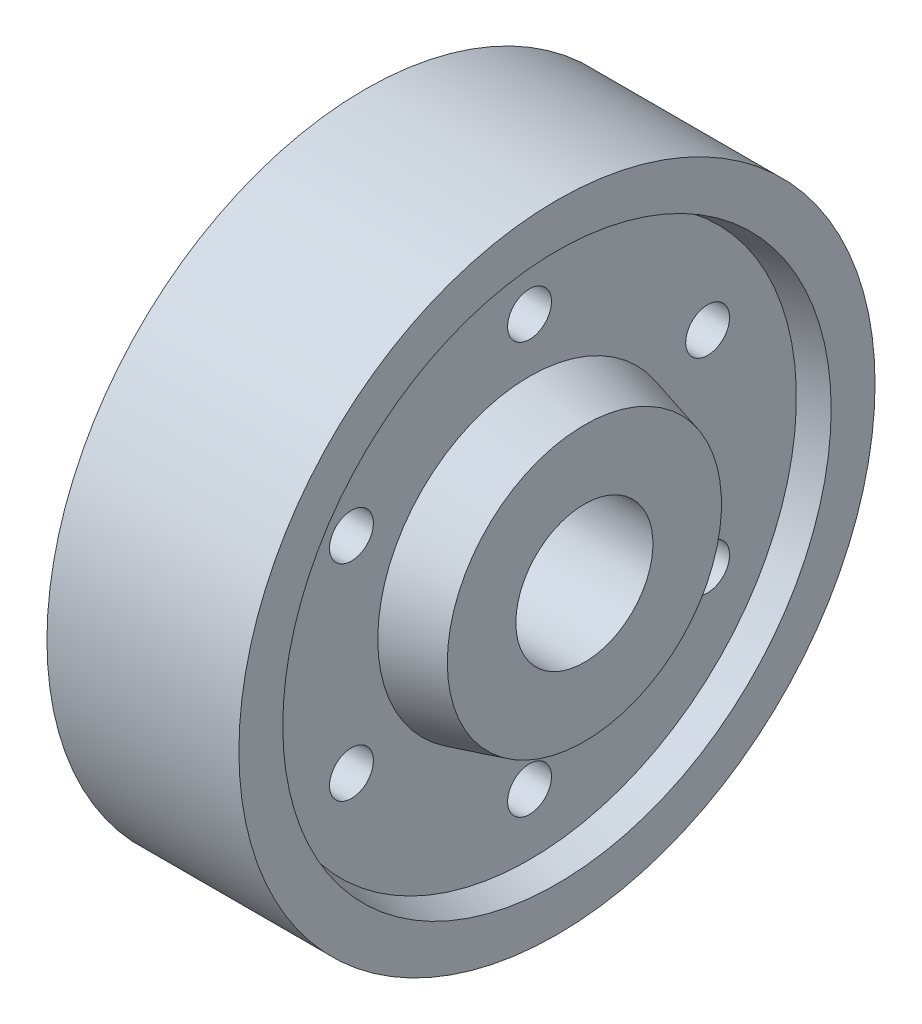
ISO-10303-21;
HEADER;
FILE_DESCRIPTION(('STEP AP214'),'2;1');
FILE_NAME('part.step','',(''),(''),'','','');
FILE_SCHEMA(('AUTOMOTIVE_DESIGN { 1 0 10303 214 1 1 1 1 }'));
ENDSEC;
DATA;
#1=APPLICATION_CONTEXT('core data for automotive mechanical design processes');
#2=APPLICATION_PROTOCOL_DEFINITION('international standard','automotive_design',2000,#1);
#3=PRODUCT_CONTEXT('',#1,'mechanical');
#4=PRODUCT('Part','Part','',(#3));
#5=PRODUCT_RELATED_PRODUCT_CATEGORY('part','',(#4));
#6=PRODUCT_DEFINITION_FORMATION('','',#4);
#7=PRODUCT_DEFINITION_CONTEXT('part definition',#1,'design');
#8=PRODUCT_DEFINITION('design','',#6,#7);
#9=PRODUCT_DEFINITION_SHAPE('','',#8);
#10=(LENGTH_UNIT() NAMED_UNIT(*) SI_UNIT(.MILLI.,.METRE.));
#11=(NAMED_UNIT(*) PLANE_ANGLE_UNIT() SI_UNIT($,.RADIAN.));
#12=(NAMED_UNIT(*) SI_UNIT($,.STERADIAN.) SOLID_ANGLE_UNIT());
#13=UNCERTAINTY_MEASURE_WITH_UNIT(LENGTH_MEASURE(1.E-05),#10,'distance_accuracy_value','');
#14=(GEOMETRIC_REPRESENTATION_CONTEXT(3) GLOBAL_UNCERTAINTY_ASSIGNED_CONTEXT((#13)) GLOBAL_UNIT_ASSIGNED_CONTEXT((#10,
#11,#12)) REPRESENTATION_CONTEXT('',''));
#15=CARTESIAN_POINT('',(0.,0.,0.));
#16=DIRECTION('',(0.,0.,1.));
#17=DIRECTION('',(1.,0.,0.));
#18=AXIS2_PLACEMENT_3D('',#15,#16,#17);
#19=CARTESIAN_POINT('',(0.,0.,0.));
#20=DIRECTION('',(-1.,0.,0.));
#21=DIRECTION('',(0.,0.,1.));
#22=AXIS2_PLACEMENT_3D('',#19,#20,#21);
#23=CYLINDRICAL_SURFACE('',#22,12.5);
#24=CARTESIAN_POINT('',(45.,0.,0.));
#25=DIRECTION('',(-1.,0.,0.));
#26=DIRECTION('',(0.,0.,1.));
#27=AXIS2_PLACEMENT_3D('',#24,#25,#26);
#28=CIRCLE('',#27,12.5);
#29=CARTESIAN_POINT('',(45.,0.,12.5));
#30=VERTEX_POINT('',#29);
#31=EDGE_CURVE('E10',#30,#30,#28,.T.);
#32=ORIENTED_EDGE('',*,*,#31,.F.);
#33=EDGE_LOOP('',(#32));
#34=FACE_BOUND('',#33,.T.);
#35=CARTESIAN_POINT('',(0.,0.,0.));
#36=DIRECTION('',(-1.,0.,0.));
#37=DIRECTION('',(0.,0.,1.));
#38=AXIS2_PLACEMENT_3D('',#35,#36,#37);
#39=CIRCLE('',#38,12.5);
#40=CARTESIAN_POINT('',(0.,0.,12.5));
#41=VERTEX_POINT('',#40);
#42=EDGE_CURVE('E68',#41,#41,#39,.T.);
#43=ORIENTED_EDGE('',*,*,#42,.T.);
#44=EDGE_LOOP('',(#43));
#45=FACE_BOUND('',#44,.T.);
#46=ADVANCED_FACE('F40',(#34,#45),#23,.F.);
#47=CARTESIAN_POINT('',(45.,0.,0.));
#48=DIRECTION('',(-1.,0.,0.));
#49=DIRECTION('',(0.,0.,1.));
#50=AXIS2_PLACEMENT_3D('',#47,#48,#49);
#51=PLANE('',#50);
#52=CARTESIAN_POINT('',(45.,0.,0.));
#53=DIRECTION('',(-1.,0.,0.));
#54=DIRECTION('',(0.,0.,1.));
#55=AXIS2_PLACEMENT_3D('',#52,#53,#54);
#56=CIRCLE('',#55,25.);
#57=CARTESIAN_POINT('',(45.,0.,25.));
#58=VERTEX_POINT('',#57);
#59=EDGE_CURVE('E42',#58,#58,#56,.T.);
#60=ORIENTED_EDGE('',*,*,#59,.F.);
#61=EDGE_LOOP('',(#60));
#62=FACE_BOUND('',#61,.T.);
#63=ORIENTED_EDGE('',*,*,#31,.T.);
#64=EDGE_LOOP('',(#63));
#65=FACE_BOUND('',#64,.T.);
#66=ADVANCED_FACE('F115',(#62,#65),#51,.F.);
#67=CARTESIAN_POINT('',(45.,0.,0.));
#68=DIRECTION('',(-1.,0.,0.));
#69=DIRECTION('',(0.,0.,1.));
#70=AXIS2_PLACEMENT_3D('',#67,#68,#69);
#71=CONICAL_SURFACE('',#70,25.,0.261799387799147);
#72=CARTESIAN_POINT('',(35.,0.,0.));
#73=DIRECTION('',(-1.,0.,0.));
#74=DIRECTION('',(0.,0.,1.));
#75=AXIS2_PLACEMENT_3D('',#72,#73,#74);
#76=CIRCLE('',#75,27.6794919243112);
#77=CARTESIAN_POINT('',(35.,0.,27.6794919243112));
#78=VERTEX_POINT('',#77);
#79=EDGE_CURVE('E47',#78,#78,#76,.T.);
#80=ORIENTED_EDGE('',*,*,#79,.F.);
#81=EDGE_LOOP('',(#80));
#82=FACE_BOUND('',#81,.T.);
#83=ORIENTED_EDGE('',*,*,#59,.T.);
#84=EDGE_LOOP('',(#83));
#85=FACE_BOUND('',#84,.T.);
#86=ADVANCED_FACE('F108',(#82,#85),#71,.T.);
#87=CARTESIAN_POINT('',(35.,0.,0.));
#88=DIRECTION('',(-1.,0.,0.));
#89=DIRECTION('',(0.,0.,1.));
#90=AXIS2_PLACEMENT_3D('',#87,#88,#89);
#91=PLANE('',#90);
#92=CARTESIAN_POINT('',(35.,37.5,0.));
#93=DIRECTION('',(-1.,0.,0.));
#94=DIRECTION('',(0.,0.,1.));
#95=AXIS2_PLACEMENT_3D('',#92,#93,#94);
#96=CIRCLE('',#95,4.);
#97=CARTESIAN_POINT('',(35.,37.5,4.));
#98=VERTEX_POINT('',#97);
#99=EDGE_CURVE('E37',#98,#98,#96,.T.);
#100=ORIENTED_EDGE('',*,*,#99,.T.);
#101=EDGE_LOOP('',(#100));
#102=FACE_BOUND('',#101,.T.);
#103=CARTESIAN_POINT('',(35.,18.7500000000004,32.4759526419162));
#104=DIRECTION('',(-1.,0.,0.));
#105=DIRECTION('',(0.,0.,1.));
#106=AXIS2_PLACEMENT_3D('',#103,#104,#105);
#107=CIRCLE('',#106,4.00000000000001);
#108=CARTESIAN_POINT('',(35.,18.7500000000004,36.4759526419162));
#109=VERTEX_POINT('',#108);
#110=EDGE_CURVE('E62',#109,#109,#107,.T.);
#111=ORIENTED_EDGE('',*,*,#110,.T.);
#112=EDGE_LOOP('',(#111));
#113=FACE_BOUND('',#112,.T.);
#114=CARTESIAN_POINT('',(35.,-18.7499999999997,32.4759526419166));
#115=DIRECTION('',(-1.,0.,0.));
#116=DIRECTION('',(0.,0.,1.));
#117=AXIS2_PLACEMENT_3D('',#114,#115,#116);
#118=CIRCLE('',#117,4.);
#119=CARTESIAN_POINT('',(35.,-18.7499999999997,36.4759526419166));
#120=VERTEX_POINT('',#119);
#121=EDGE_CURVE('E65',#120,#120,#118,.T.);
#122=ORIENTED_EDGE('',*,*,#121,.T.);
#123=EDGE_LOOP('',(#122));
#124=FACE_BOUND('',#123,.T.);
#125=CARTESIAN_POINT('',(35.,-37.5,2.61861100413235E-13));
#126=DIRECTION('',(-1.,0.,0.));
#127=DIRECTION('',(0.,0.,1.));
#128=AXIS2_PLACEMENT_3D('',#125,#126,#127);
#129=CIRCLE('',#128,4.);
#130=CARTESIAN_POINT('',(35.,-37.5,4.00000000000026));
#131=VERTEX_POINT('',#130);
#132=EDGE_CURVE('E58',#131,#131,#129,.T.);
#133=ORIENTED_EDGE('',*,*,#132,.T.);
#134=EDGE_LOOP('',(#133));
#135=FACE_BOUND('',#134,.T.);
#136=CARTESIAN_POINT('',(35.,-18.7500000000002,-32.4759526419164));
#137=DIRECTION('',(-1.,0.,0.));
#138=DIRECTION('',(0.,0.,1.));
#139=AXIS2_PLACEMENT_3D('',#136,#137,#138);
#140=CIRCLE('',#139,4.);
#141=CARTESIAN_POINT('',(35.,-18.7500000000002,-28.4759526419164));
#142=VERTEX_POINT('',#141);
#143=EDGE_CURVE('E57',#142,#142,#140,.T.);
#144=ORIENTED_EDGE('',*,*,#143,.T.);
#145=EDGE_LOOP('',(#144));
#146=FACE_BOUND('',#145,.T.);
#147=CARTESIAN_POINT('',(35.,18.7499999999999,-32.4759526419165));
#148=DIRECTION('',(-1.,0.,0.));
#149=DIRECTION('',(0.,0.,1.));
#150=AXIS2_PLACEMENT_3D('',#147,#148,#149);
#151=CIRCLE('',#150,4.);
#152=CARTESIAN_POINT('',(35.,18.7499999999999,-28.4759526419165));
#153=VERTEX_POINT('',#152);
#154=EDGE_CURVE('E52',#153,#153,#151,.T.);
#155=ORIENTED_EDGE('',*,*,#154,.T.);
#156=EDGE_LOOP('',(#155));
#157=FACE_BOUND('',#156,.T.);
#158=CARTESIAN_POINT('',(35.,0.,0.));
#159=DIRECTION('',(-1.,0.,0.));
#160=DIRECTION('',(0.,0.,1.));
#161=AXIS2_PLACEMENT_3D('',#158,#159,#160);
#162=CIRCLE('',#161,48.6602540378444);
#163=CARTESIAN_POINT('',(35.,0.,48.6602540378444));
#164=VERTEX_POINT('',#163);
#165=EDGE_CURVE('E105',#164,#164,#162,.T.);
#166=ORIENTED_EDGE('',*,*,#165,.F.);
#167=EDGE_LOOP('',(#166));
#168=FACE_BOUND('',#167,.T.);
#169=ORIENTED_EDGE('',*,*,#79,.T.);
#170=EDGE_LOOP('',(#169));
#171=FACE_BOUND('',#170,.T.);
#172=ADVANCED_FACE('F110',(#102,#113,#124,#135,#146,#157,#168,#171),#91,.F.);
#173=CARTESIAN_POINT('',(35.,0.,0.));
#174=DIRECTION('',(1.,0.,0.));
#175=DIRECTION('',(0.,0.,-1.));
#176=AXIS2_PLACEMENT_3D('',#173,#174,#175);
#177=CONICAL_SURFACE('',#176,48.6602540378444,0.261799387799145);
#178=CARTESIAN_POINT('',(40.,0.,0.));
#179=DIRECTION('',(-1.,0.,0.));
#180=DIRECTION('',(0.,0.,1.));
#181=AXIS2_PLACEMENT_3D('',#178,#179,#180);
#182=CIRCLE('',#181,50.);
#183=CARTESIAN_POINT('',(40.,0.,50.));
#184=VERTEX_POINT('',#183);
#185=EDGE_CURVE('E97',#184,#184,#182,.T.);
#186=ORIENTED_EDGE('',*,*,#185,.F.);
#187=EDGE_LOOP('',(#186));
#188=FACE_BOUND('',#187,.T.);
#189=ORIENTED_EDGE('',*,*,#165,.T.);
#190=EDGE_LOOP('',(#189));
#191=FACE_BOUND('',#190,.T.);
#192=ADVANCED_FACE('F121',(#188,#191),#177,.F.);
#193=CARTESIAN_POINT('',(40.,0.,0.));
#194=DIRECTION('',(-1.,0.,0.));
#195=DIRECTION('',(0.,0.,1.));
#196=AXIS2_PLACEMENT_3D('',#193,#194,#195);
#197=PLANE('',#196);
#198=CARTESIAN_POINT('',(40.,0.,0.));
#199=DIRECTION('',(-1.,0.,0.));
#200=DIRECTION('',(0.,0.,1.));
#201=AXIS2_PLACEMENT_3D('',#198,#199,#200);
#202=CIRCLE('',#201,58.);
#203=CARTESIAN_POINT('',(40.,0.,58.));
#204=VERTEX_POINT('',#203);
#205=EDGE_CURVE('E96',#204,#204,#202,.T.);
#206=ORIENTED_EDGE('',*,*,#205,.F.);
#207=EDGE_LOOP('',(#206));
#208=FACE_BOUND('',#207,.T.);
#209=ORIENTED_EDGE('',*,*,#185,.T.);
#210=EDGE_LOOP('',(#209));
#211=FACE_BOUND('',#210,.T.);
#212=ADVANCED_FACE('F130',(#208,#211),#197,.F.);
#213=CARTESIAN_POINT('',(0.,0.,0.));
#214=DIRECTION('',(-1.,0.,0.));
#215=DIRECTION('',(0.,0.,1.));
#216=AXIS2_PLACEMENT_3D('',#213,#214,#215);
#217=CYLINDRICAL_SURFACE('',#216,58.);
#218=ORIENTED_EDGE('',*,*,#205,.T.);
#219=EDGE_LOOP('',(#218));
#220=FACE_BOUND('',#219,.T.);
#221=CARTESIAN_POINT('',(5.,0.,0.));
#222=DIRECTION('',(-1.,0.,0.));
#223=DIRECTION('',(0.,0.,1.));
#224=AXIS2_PLACEMENT_3D('',#221,#222,#223);
#225=CIRCLE('',#224,58.);
#226=CARTESIAN_POINT('',(5.,0.,58.));
#227=VERTEX_POINT('',#226);
#228=EDGE_CURVE('E91',#227,#227,#225,.T.);
#229=ORIENTED_EDGE('',*,*,#228,.F.);
#230=EDGE_LOOP('',(#229));
#231=FACE_BOUND('',#230,.T.);
#232=ADVANCED_FACE('F134',(#220,#231),#217,.T.);
#233=CARTESIAN_POINT('',(5.,0.,0.));
#234=DIRECTION('',(-1.,0.,0.));
#235=DIRECTION('',(0.,0.,1.));
#236=AXIS2_PLACEMENT_3D('',#233,#234,#235);
#237=PLANE('',#236);
#238=ORIENTED_EDGE('',*,*,#228,.T.);
#239=EDGE_LOOP('',(#238));
#240=FACE_BOUND('',#239,.T.);
#241=CARTESIAN_POINT('',(5.,0.,0.));
#242=DIRECTION('',(-1.,0.,0.));
#243=DIRECTION('',(0.,0.,1.));
#244=AXIS2_PLACEMENT_3D('',#241,#242,#243);
#245=CIRCLE('',#244,50.);
#246=CARTESIAN_POINT('',(5.,0.,50.));
#247=VERTEX_POINT('',#246);
#248=EDGE_CURVE('E89',#247,#247,#245,.T.);
#249=ORIENTED_EDGE('',*,*,#248,.F.);
#250=EDGE_LOOP('',(#249));
#251=FACE_BOUND('',#250,.T.);
#252=ADVANCED_FACE('F132',(#240,#251),#237,.T.);
#253=CARTESIAN_POINT('',(10.,0.,0.));
#254=DIRECTION('',(-1.,0.,0.));
#255=DIRECTION('',(0.,0.,1.));
#256=AXIS2_PLACEMENT_3D('',#253,#254,#255);
#257=CONICAL_SURFACE('',#256,48.6602540378444,0.261799387799145);
#258=ORIENTED_EDGE('',*,*,#248,.T.);
#259=EDGE_LOOP('',(#258));
#260=FACE_BOUND('',#259,.T.);
#261=CARTESIAN_POINT('',(10.,0.,0.));
#262=DIRECTION('',(-1.,0.,0.));
#263=DIRECTION('',(0.,0.,1.));
#264=AXIS2_PLACEMENT_3D('',#261,#262,#263);
#265=CIRCLE('',#264,48.6602540378444);
#266=CARTESIAN_POINT('',(10.,0.,48.6602540378444));
#267=VERTEX_POINT('',#266);
#268=EDGE_CURVE('E87',#267,#267,#265,.T.);
#269=ORIENTED_EDGE('',*,*,#268,.F.);
#270=EDGE_LOOP('',(#269));
#271=FACE_BOUND('',#270,.T.);
#272=ADVANCED_FACE('F136',(#260,#271),#257,.F.);
#273=CARTESIAN_POINT('',(10.,0.,0.));
#274=DIRECTION('',(-1.,0.,0.));
#275=DIRECTION('',(0.,0.,1.));
#276=AXIS2_PLACEMENT_3D('',#273,#274,#275);
#277=PLANE('',#276);
#278=CARTESIAN_POINT('',(10.,37.5,0.));
#279=DIRECTION('',(1.,0.,0.));
#280=DIRECTION('',(0.,0.,-1.));
#281=AXIS2_PLACEMENT_3D('',#278,#279,#280);
#282=CIRCLE('',#281,4.);
#283=CARTESIAN_POINT('',(10.,37.5,-4.));
#284=VERTEX_POINT('',#283);
#285=EDGE_CURVE('E60',#284,#284,#282,.T.);
#286=ORIENTED_EDGE('',*,*,#285,.T.);
#287=EDGE_LOOP('',(#286));
#288=FACE_BOUND('',#287,.T.);
#289=CARTESIAN_POINT('',(10.,18.7500000000004,32.4759526419162));
#290=DIRECTION('',(1.,0.,0.));
#291=DIRECTION('',(0.,0.,-1.));
#292=AXIS2_PLACEMENT_3D('',#289,#290,#291);
#293=CIRCLE('',#292,4.00000000000001);
#294=CARTESIAN_POINT('',(10.,18.7500000000004,28.4759526419162));
#295=VERTEX_POINT('',#294);
#296=EDGE_CURVE('E187',#295,#295,#293,.T.);
#297=ORIENTED_EDGE('',*,*,#296,.T.);
#298=EDGE_LOOP('',(#297));
#299=FACE_BOUND('',#298,.T.);
#300=CARTESIAN_POINT('',(10.,-18.7499999999997,32.4759526419166));
#301=DIRECTION('',(1.,0.,0.));
#302=DIRECTION('',(0.,0.,-1.));
#303=AXIS2_PLACEMENT_3D('',#300,#301,#302);
#304=CIRCLE('',#303,4.);
#305=CARTESIAN_POINT('',(10.,-18.7499999999997,28.4759526419166));
#306=VERTEX_POINT('',#305);
#307=EDGE_CURVE('E85',#306,#306,#304,.T.);
#308=ORIENTED_EDGE('',*,*,#307,.T.);
#309=EDGE_LOOP('',(#308));
#310=FACE_BOUND('',#309,.T.);
#311=CARTESIAN_POINT('',(10.,-37.5,2.61861100413235E-13));
#312=DIRECTION('',(1.,0.,0.));
#313=DIRECTION('',(0.,0.,-1.));
#314=AXIS2_PLACEMENT_3D('',#311,#312,#313);
#315=CIRCLE('',#314,4.);
#316=CARTESIAN_POINT('',(10.,-37.5,-3.99999999999974));
#317=VERTEX_POINT('',#316);
#318=EDGE_CURVE('E191',#317,#317,#315,.T.);
#319=ORIENTED_EDGE('',*,*,#318,.T.);
#320=EDGE_LOOP('',(#319));
#321=FACE_BOUND('',#320,.T.);
#322=CARTESIAN_POINT('',(10.,-18.7500000000002,-32.4759526419164));
#323=DIRECTION('',(1.,0.,0.));
#324=DIRECTION('',(0.,0.,-1.));
#325=AXIS2_PLACEMENT_3D('',#322,#323,#324);
#326=CIRCLE('',#325,4.);
#327=CARTESIAN_POINT('',(10.,-18.7500000000002,-36.4759526419164));
#328=VERTEX_POINT('',#327);
#329=EDGE_CURVE('E186',#328,#328,#326,.T.);
#330=ORIENTED_EDGE('',*,*,#329,.T.);
#331=EDGE_LOOP('',(#330));
#332=FACE_BOUND('',#331,.T.);
#333=CARTESIAN_POINT('',(10.,18.7499999999999,-32.4759526419165));
#334=DIRECTION('',(1.,0.,0.));
#335=DIRECTION('',(0.,0.,-1.));
#336=AXIS2_PLACEMENT_3D('',#333,#334,#335);
#337=CIRCLE('',#336,4.);
#338=CARTESIAN_POINT('',(10.,18.7499999999999,-36.4759526419165));
#339=VERTEX_POINT('',#338);
#340=EDGE_CURVE('E184',#339,#339,#337,.T.);
#341=ORIENTED_EDGE('',*,*,#340,.T.);
#342=EDGE_LOOP('',(#341));
#343=FACE_BOUND('',#342,.T.);
#344=ORIENTED_EDGE('',*,*,#268,.T.);
#345=EDGE_LOOP('',(#344));
#346=FACE_BOUND('',#345,.T.);
#347=CARTESIAN_POINT('',(10.,0.,0.));
#348=DIRECTION('',(-1.,0.,0.));
#349=DIRECTION('',(0.,0.,1.));
#350=AXIS2_PLACEMENT_3D('',#347,#348,#349);
#351=CIRCLE('',#350,27.6794919243112);
#352=CARTESIAN_POINT('',(10.,0.,27.6794919243112));
#353=VERTEX_POINT('',#352);
#354=EDGE_CURVE('E78',#353,#353,#351,.T.);
#355=ORIENTED_EDGE('',*,*,#354,.F.);
#356=EDGE_LOOP('',(#355));
#357=FACE_BOUND('',#356,.T.);
#358=ADVANCED_FACE('F141',(#288,#299,#310,#321,#332,#343,#346,#357),#277,.T.);
#359=CARTESIAN_POINT('',(0.,0.,0.));
#360=DIRECTION('',(1.,0.,0.));
#361=DIRECTION('',(0.,0.,-1.));
#362=AXIS2_PLACEMENT_3D('',#359,#360,#361);
#363=CONICAL_SURFACE('',#362,25.,0.261799387799147);
#364=ORIENTED_EDGE('',*,*,#354,.T.);
#365=EDGE_LOOP('',(#364));
#366=FACE_BOUND('',#365,.T.);
#367=CARTESIAN_POINT('',(0.,0.,0.));
#368=DIRECTION('',(-1.,0.,0.));
#369=DIRECTION('',(0.,0.,1.));
#370=AXIS2_PLACEMENT_3D('',#367,#368,#369);
#371=CIRCLE('',#370,25.);
#372=CARTESIAN_POINT('',(0.,0.,25.));
#373=VERTEX_POINT('',#372);
#374=EDGE_CURVE('E74',#373,#373,#371,.T.);
#375=ORIENTED_EDGE('',*,*,#374,.F.);
#376=EDGE_LOOP('',(#375));
#377=FACE_BOUND('',#376,.T.);
#378=ADVANCED_FACE('F150',(#366,#377),#363,.T.);
#379=CARTESIAN_POINT('',(0.,0.,0.));
#380=DIRECTION('',(-1.,0.,0.));
#381=DIRECTION('',(0.,0.,1.));
#382=AXIS2_PLACEMENT_3D('',#379,#380,#381);
#383=PLANE('',#382);
#384=ORIENTED_EDGE('',*,*,#374,.T.);
#385=EDGE_LOOP('',(#384));
#386=FACE_BOUND('',#385,.T.);
#387=ORIENTED_EDGE('',*,*,#42,.F.);
#388=EDGE_LOOP('',(#387));
#389=FACE_BOUND('',#388,.T.);
#390=ADVANCED_FACE('F151',(#386,#389),#383,.T.);
#391=CARTESIAN_POINT('',(10.,18.7499999999999,-32.4759526419165));
#392=DIRECTION('',(1.,0.,0.));
#393=DIRECTION('',(0.,0.,-1.));
#394=AXIS2_PLACEMENT_3D('',#391,#392,#393);
#395=CYLINDRICAL_SURFACE('',#394,4.);
#396=ORIENTED_EDGE('',*,*,#340,.F.);
#397=EDGE_LOOP('',(#396));
#398=FACE_BOUND('',#397,.T.);
#399=ORIENTED_EDGE('',*,*,#154,.F.);
#400=EDGE_LOOP('',(#399));
#401=FACE_BOUND('',#400,.T.);
#402=ADVANCED_FACE('F154',(#398,#401),#395,.F.);
#403=CARTESIAN_POINT('',(10.,-18.7500000000002,-32.4759526419164));
#404=DIRECTION('',(1.,0.,0.));
#405=DIRECTION('',(0.,0.,-1.));
#406=AXIS2_PLACEMENT_3D('',#403,#404,#405);
#407=CYLINDRICAL_SURFACE('',#406,4.);
#408=ORIENTED_EDGE('',*,*,#329,.F.);
#409=EDGE_LOOP('',(#408));
#410=FACE_BOUND('',#409,.T.);
#411=ORIENTED_EDGE('',*,*,#143,.F.);
#412=EDGE_LOOP('',(#411));
#413=FACE_BOUND('',#412,.T.);
#414=ADVANCED_FACE('F164',(#410,#413),#407,.F.);
#415=CARTESIAN_POINT('',(10.,-37.5,2.61861100413235E-13));
#416=DIRECTION('',(1.,0.,0.));
#417=DIRECTION('',(0.,0.,-1.));
#418=AXIS2_PLACEMENT_3D('',#415,#416,#417);
#419=CYLINDRICAL_SURFACE('',#418,4.);
#420=ORIENTED_EDGE('',*,*,#318,.F.);
#421=EDGE_LOOP('',(#420));
#422=FACE_BOUND('',#421,.T.);
#423=ORIENTED_EDGE('',*,*,#132,.F.);
#424=EDGE_LOOP('',(#423));
#425=FACE_BOUND('',#424,.T.);
#426=ADVANCED_FACE('F161',(#422,#425),#419,.F.);
#427=CARTESIAN_POINT('',(10.,-18.7499999999997,32.4759526419166));
#428=DIRECTION('',(1.,0.,0.));
#429=DIRECTION('',(0.,0.,-1.));
#430=AXIS2_PLACEMENT_3D('',#427,#428,#429);
#431=CYLINDRICAL_SURFACE('',#430,4.);
#432=ORIENTED_EDGE('',*,*,#307,.F.);
#433=EDGE_LOOP('',(#432));
#434=FACE_BOUND('',#433,.T.);
#435=ORIENTED_EDGE('',*,*,#121,.F.);
#436=EDGE_LOOP('',(#435));
#437=FACE_BOUND('',#436,.T.);
#438=ADVANCED_FACE('F160',(#434,#437),#431,.F.);
#439=CARTESIAN_POINT('',(10.,18.7500000000004,32.4759526419162));
#440=DIRECTION('',(1.,0.,0.));
#441=DIRECTION('',(0.,0.,-1.));
#442=AXIS2_PLACEMENT_3D('',#439,#440,#441);
#443=CYLINDRICAL_SURFACE('',#442,4.00000000000001);
#444=ORIENTED_EDGE('',*,*,#296,.F.);
#445=EDGE_LOOP('',(#444));
#446=FACE_BOUND('',#445,.T.);
#447=ORIENTED_EDGE('',*,*,#110,.F.);
#448=EDGE_LOOP('',(#447));
#449=FACE_BOUND('',#448,.T.);
#450=ADVANCED_FACE('F159',(#446,#449),#443,.F.);
#451=CARTESIAN_POINT('',(10.,37.5,0.));
#452=DIRECTION('',(1.,0.,0.));
#453=DIRECTION('',(0.,0.,-1.));
#454=AXIS2_PLACEMENT_3D('',#451,#452,#453);
#455=CYLINDRICAL_SURFACE('',#454,4.);
#456=ORIENTED_EDGE('',*,*,#285,.F.);
#457=EDGE_LOOP('',(#456));
#458=FACE_BOUND('',#457,.T.);
#459=ORIENTED_EDGE('',*,*,#99,.F.);
#460=EDGE_LOOP('',(#459));
#461=FACE_BOUND('',#460,.T.);
#462=ADVANCED_FACE('F172',(#458,#461),#455,.F.);
#463=CLOSED_SHELL('',(#46,#66,#86,#172,#192,#212,#232,#252,#272,#358,#378,#390,#402,#414,#426,
#438,#450,#462));
#464=MANIFOLD_SOLID_BREP('B2',#463);
#465=ADVANCED_BREP_SHAPE_REPRESENTATION('',(#18,#464),#14);
#466=SHAPE_DEFINITION_REPRESENTATION(#9,#465);
ENDSEC;
END-ISO-10303-21;
